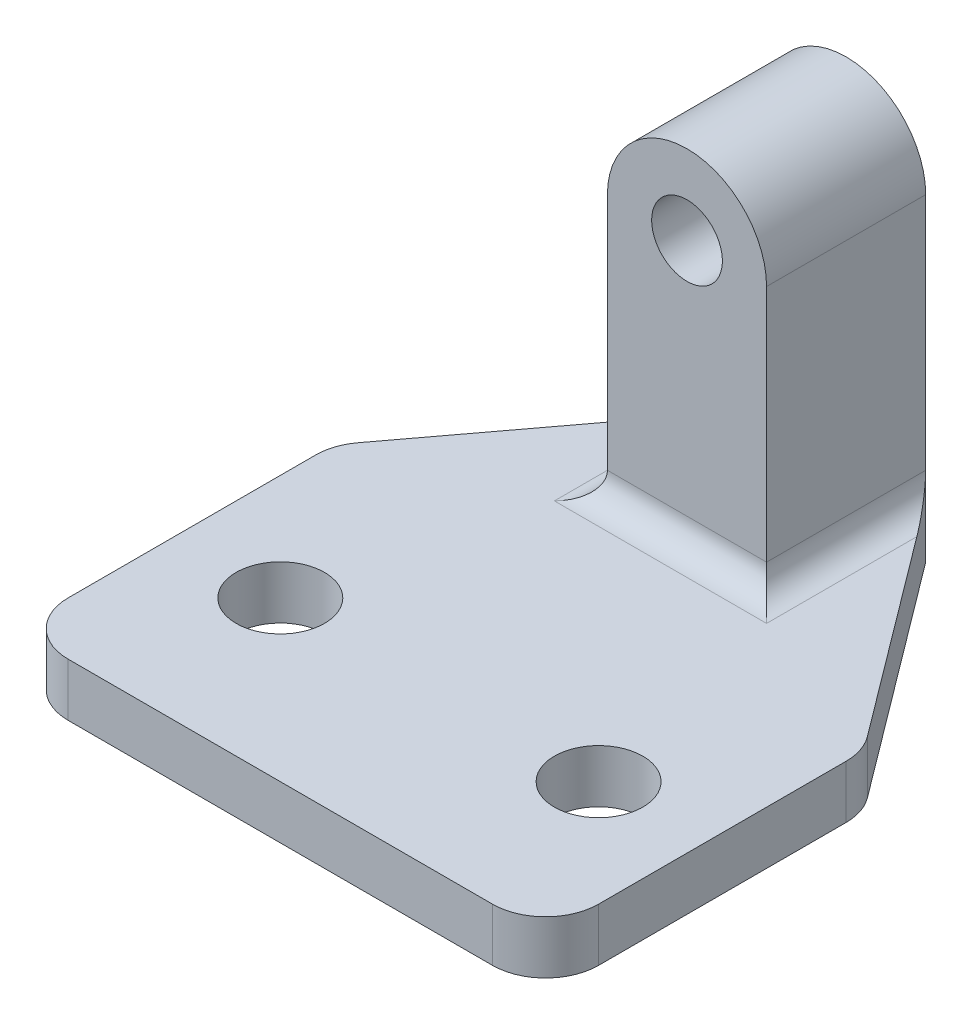
ISO-10303-21;
HEADER;
FILE_DESCRIPTION(('STEP AP214'),'2;1');
FILE_NAME('part.step','',(''),(''),'','','');
FILE_SCHEMA(('AUTOMOTIVE_DESIGN { 1 0 10303 214 1 1 1 1 }'));
ENDSEC;
DATA;
#1=APPLICATION_CONTEXT('core data for automotive mechanical design processes');
#2=APPLICATION_PROTOCOL_DEFINITION('international standard','automotive_design',2000,#1);
#3=PRODUCT_CONTEXT('',#1,'mechanical');
#4=PRODUCT('Part','Part','',(#3));
#5=PRODUCT_RELATED_PRODUCT_CATEGORY('part','',(#4));
#6=PRODUCT_DEFINITION_FORMATION('','',#4);
#7=PRODUCT_DEFINITION_CONTEXT('part definition',#1,'design');
#8=PRODUCT_DEFINITION('design','',#6,#7);
#9=PRODUCT_DEFINITION_SHAPE('','',#8);
#10=(LENGTH_UNIT() NAMED_UNIT(*) SI_UNIT(.MILLI.,.METRE.));
#11=(NAMED_UNIT(*) PLANE_ANGLE_UNIT() SI_UNIT($,.RADIAN.));
#12=(NAMED_UNIT(*) SI_UNIT($,.STERADIAN.) SOLID_ANGLE_UNIT());
#13=UNCERTAINTY_MEASURE_WITH_UNIT(LENGTH_MEASURE(1.E-05),#10,'distance_accuracy_value','');
#14=(GEOMETRIC_REPRESENTATION_CONTEXT(3) GLOBAL_UNCERTAINTY_ASSIGNED_CONTEXT((#13)) GLOBAL_UNIT_ASSIGNED_CONTEXT((#10,
#11,#12)) REPRESENTATION_CONTEXT('',''));
#15=CARTESIAN_POINT('',(0.,0.,0.));
#16=DIRECTION('',(0.,0.,1.));
#17=DIRECTION('',(1.,0.,0.));
#18=AXIS2_PLACEMENT_3D('',#15,#16,#17);
#19=CARTESIAN_POINT('',(0.,3.,0.));
#20=DIRECTION('',(0.,-1.,0.));
#21=DIRECTION('',(0.,0.,-1.));
#22=AXIS2_PLACEMENT_3D('',#19,#20,#21);
#23=PLANE('',#22);
#24=CARTESIAN_POINT('',(-9.,3.,0.));
#25=DIRECTION('',(0.,1.,0.));
#26=DIRECTION('',(0.,0.,1.));
#27=AXIS2_PLACEMENT_3D('',#24,#25,#26);
#28=CIRCLE('',#27,2.5);
#29=CARTESIAN_POINT('',(-9.,3.,2.5));
#30=VERTEX_POINT('',#29);
#31=EDGE_CURVE('E627',#30,#30,#28,.T.);
#32=ORIENTED_EDGE('',*,*,#31,.F.);
#33=EDGE_LOOP('',(#32));
#34=FACE_BOUND('',#33,.T.);
#35=CARTESIAN_POINT('',(9.,3.,0.));
#36=DIRECTION('',(0.,1.,0.));
#37=DIRECTION('',(0.,0.,-1.));
#38=AXIS2_PLACEMENT_3D('',#35,#36,#37);
#39=CIRCLE('',#38,2.5);
#40=CARTESIAN_POINT('',(9.,3.,-2.5));
#41=VERTEX_POINT('',#40);
#42=EDGE_CURVE('E623',#41,#41,#39,.T.);
#43=ORIENTED_EDGE('',*,*,#42,.F.);
#44=EDGE_LOOP('',(#43));
#45=FACE_BOUND('',#44,.T.);
#46=DIRECTION('',(-0.6,0.,0.8));
#47=VECTOR('',#46,1.);
#48=CARTESIAN_POINT('',(-15.,3.,-9.));
#49=LINE('',#48,#47);
#50=CARTESIAN_POINT('',(-6.,3.,-21.));
#51=VERTEX_POINT('',#50);
#52=CARTESIAN_POINT('',(-14.4,3.,-9.79999999999999));
#53=VERTEX_POINT('',#52);
#54=EDGE_CURVE('E212',#51,#53,#49,.T.);
#55=ORIENTED_EDGE('',*,*,#54,.T.);
#56=CARTESIAN_POINT('',(-12.,3.,-7.99999999999999));
#57=DIRECTION('',(0.,-1.,0.));
#58=DIRECTION('',(0.,0.,-1.));
#59=AXIS2_PLACEMENT_3D('',#56,#57,#58);
#60=CIRCLE('',#59,3.);
#61=CARTESIAN_POINT('',(-15.,3.,-7.99999999999999));
#62=VERTEX_POINT('',#61);
#63=EDGE_CURVE('E310',#53,#62,#60,.F.);
#64=ORIENTED_EDGE('',*,*,#63,.T.);
#65=DIRECTION('',(0.,0.,1.));
#66=VECTOR('',#65,1.);
#67=CARTESIAN_POINT('',(-15.,3.,9.));
#68=LINE('',#67,#66);
#69=CARTESIAN_POINT('',(-15.,3.,6.));
#70=VERTEX_POINT('',#69);
#71=EDGE_CURVE('E197',#62,#70,#68,.T.);
#72=ORIENTED_EDGE('',*,*,#71,.T.);
#73=CARTESIAN_POINT('',(-12.,3.,6.));
#74=DIRECTION('',(0.,-1.,0.));
#75=DIRECTION('',(0.,0.,-1.));
#76=AXIS2_PLACEMENT_3D('',#73,#74,#75);
#77=CIRCLE('',#76,3.);
#78=CARTESIAN_POINT('',(-12.,3.,9.));
#79=VERTEX_POINT('',#78);
#80=EDGE_CURVE('E302',#70,#79,#77,.F.);
#81=ORIENTED_EDGE('',*,*,#80,.T.);
#82=DIRECTION('',(1.,0.,0.));
#83=VECTOR('',#82,1.);
#84=CARTESIAN_POINT('',(15.,3.,9.));
#85=LINE('',#84,#83);
#86=CARTESIAN_POINT('',(12.,3.,9.));
#87=VERTEX_POINT('',#86);
#88=EDGE_CURVE('E201',#79,#87,#85,.T.);
#89=ORIENTED_EDGE('',*,*,#88,.T.);
#90=CARTESIAN_POINT('',(12.,3.,6.));
#91=DIRECTION('',(0.,-1.,0.));
#92=DIRECTION('',(0.,0.,-1.));
#93=AXIS2_PLACEMENT_3D('',#90,#91,#92);
#94=CIRCLE('',#93,3.);
#95=CARTESIAN_POINT('',(15.,3.,6.));
#96=VERTEX_POINT('',#95);
#97=EDGE_CURVE('E305',#87,#96,#94,.F.);
#98=ORIENTED_EDGE('',*,*,#97,.T.);
#99=DIRECTION('',(0.,0.,-1.));
#100=VECTOR('',#99,1.);
#101=CARTESIAN_POINT('',(15.,3.,9.));
#102=LINE('',#101,#100);
#103=CARTESIAN_POINT('',(15.,3.,-8.));
#104=VERTEX_POINT('',#103);
#105=EDGE_CURVE('E206',#96,#104,#102,.T.);
#106=ORIENTED_EDGE('',*,*,#105,.T.);
#107=CARTESIAN_POINT('',(12.,3.,-8.));
#108=DIRECTION('',(0.,-1.,0.));
#109=DIRECTION('',(0.,0.,-1.));
#110=AXIS2_PLACEMENT_3D('',#107,#108,#109);
#111=CIRCLE('',#110,3.);
#112=CARTESIAN_POINT('',(14.4,3.,-9.8));
#113=VERTEX_POINT('',#112);
#114=EDGE_CURVE('E59',#104,#113,#111,.F.);
#115=ORIENTED_EDGE('',*,*,#114,.T.);
#116=DIRECTION('',(-0.6,0.,-0.8));
#117=VECTOR('',#116,1.);
#118=CARTESIAN_POINT('',(4.5,3.,-23.));
#119=LINE('',#118,#117);
#120=CARTESIAN_POINT('',(6.,3.,-21.));
#121=VERTEX_POINT('',#120);
#122=EDGE_CURVE('E209',#113,#121,#119,.T.);
#123=ORIENTED_EDGE('',*,*,#122,.T.);
#124=DIRECTION('',(0.,0.,-1.));
#125=VECTOR('',#124,1.);
#126=CARTESIAN_POINT('',(6.,3.,0.));
#127=LINE('',#126,#125);
#128=CARTESIAN_POINT('',(6.,3.,-12.5));
#129=VERTEX_POINT('',#128);
#130=EDGE_CURVE('E246',#121,#129,#127,.F.);
#131=ORIENTED_EDGE('',*,*,#130,.T.);
#132=DIRECTION('',(-1.,0.,0.));
#133=VECTOR('',#132,1.);
#134=CARTESIAN_POINT('',(-4.5,3.,-12.5));
#135=LINE('',#134,#133);
#136=CARTESIAN_POINT('',(-6.,3.,-12.5));
#137=VERTEX_POINT('',#136);
#138=EDGE_CURVE('E243',#129,#137,#135,.T.);
#139=ORIENTED_EDGE('',*,*,#138,.T.);
#140=DIRECTION('',(0.,0.,-1.));
#141=VECTOR('',#140,1.);
#142=CARTESIAN_POINT('',(-6.,3.,0.));
#143=LINE('',#142,#141);
#144=EDGE_CURVE('E249',#137,#51,#143,.T.);
#145=ORIENTED_EDGE('',*,*,#144,.T.);
#146=EDGE_LOOP('',(#55,#64,#72,#81,#89,#98,#106,#115,#123,#131,#139,#145));
#147=FACE_BOUND('',#146,.T.);
#148=ADVANCED_FACE('F43',(#34,#45,#147),#23,.F.);
#149=CARTESIAN_POINT('',(-15.,3.,9.));
#150=DIRECTION('',(1.,0.,0.));
#151=DIRECTION('',(0.,0.,-1.));
#152=AXIS2_PLACEMENT_3D('',#149,#150,#151);
#153=PLANE('',#152);
#154=ORIENTED_EDGE('',*,*,#71,.F.);
#155=DIRECTION('',(0.,-1.,0.));
#156=VECTOR('',#155,1.);
#157=CARTESIAN_POINT('',(-15.,3.,-7.99999999999999));
#158=LINE('',#157,#156);
#159=CARTESIAN_POINT('',(-15.,0.,-7.99999999999999));
#160=VERTEX_POINT('',#159);
#161=EDGE_CURVE('E283',#62,#160,#158,.T.);
#162=ORIENTED_EDGE('',*,*,#161,.T.);
#163=DIRECTION('',(0.,0.,1.));
#164=VECTOR('',#163,1.);
#165=CARTESIAN_POINT('',(-15.,0.,9.));
#166=LINE('',#165,#164);
#167=CARTESIAN_POINT('',(-15.,0.,6.));
#168=VERTEX_POINT('',#167);
#169=EDGE_CURVE('E195',#160,#168,#166,.T.);
#170=ORIENTED_EDGE('',*,*,#169,.T.);
#171=DIRECTION('',(0.,-1.,0.));
#172=VECTOR('',#171,1.);
#173=CARTESIAN_POINT('',(-15.,3.,6.));
#174=LINE('',#173,#172);
#175=EDGE_CURVE('E270',#168,#70,#174,.F.);
#176=ORIENTED_EDGE('',*,*,#175,.T.);
#177=EDGE_LOOP('',(#154,#162,#170,#176));
#178=FACE_BOUND('',#177,.T.);
#179=ADVANCED_FACE('F378',(#178),#153,.F.);
#180=CARTESIAN_POINT('',(15.,3.,9.));
#181=DIRECTION('',(0.,0.,-1.));
#182=DIRECTION('',(-1.,0.,0.));
#183=AXIS2_PLACEMENT_3D('',#180,#181,#182);
#184=PLANE('',#183);
#185=DIRECTION('',(1.,0.,0.));
#186=VECTOR('',#185,1.);
#187=CARTESIAN_POINT('',(15.,0.,9.));
#188=LINE('',#187,#186);
#189=CARTESIAN_POINT('',(-12.,0.,9.));
#190=VERTEX_POINT('',#189);
#191=CARTESIAN_POINT('',(12.,0.,9.));
#192=VERTEX_POINT('',#191);
#193=EDGE_CURVE('E220',#190,#192,#188,.T.);
#194=ORIENTED_EDGE('',*,*,#193,.T.);
#195=DIRECTION('',(0.,-1.,0.));
#196=VECTOR('',#195,1.);
#197=CARTESIAN_POINT('',(12.,3.,9.));
#198=LINE('',#197,#196);
#199=EDGE_CURVE('E11',#192,#87,#198,.F.);
#200=ORIENTED_EDGE('',*,*,#199,.T.);
#201=ORIENTED_EDGE('',*,*,#88,.F.);
#202=DIRECTION('',(0.,-1.,0.));
#203=VECTOR('',#202,1.);
#204=CARTESIAN_POINT('',(-12.,3.,9.));
#205=LINE('',#204,#203);
#206=EDGE_CURVE('E52',#79,#190,#205,.T.);
#207=ORIENTED_EDGE('',*,*,#206,.T.);
#208=EDGE_LOOP('',(#194,#200,#201,#207));
#209=FACE_BOUND('',#208,.T.);
#210=ADVANCED_FACE('F328',(#209),#184,.F.);
#211=CARTESIAN_POINT('',(15.,3.,9.));
#212=DIRECTION('',(-1.,0.,0.));
#213=DIRECTION('',(0.,0.,1.));
#214=AXIS2_PLACEMENT_3D('',#211,#212,#213);
#215=PLANE('',#214);
#216=DIRECTION('',(0.,0.,-1.));
#217=VECTOR('',#216,1.);
#218=CARTESIAN_POINT('',(15.,0.,9.));
#219=LINE('',#218,#217);
#220=CARTESIAN_POINT('',(15.,0.,6.));
#221=VERTEX_POINT('',#220);
#222=CARTESIAN_POINT('',(15.,0.,-8.));
#223=VERTEX_POINT('',#222);
#224=EDGE_CURVE('E224',#221,#223,#219,.T.);
#225=ORIENTED_EDGE('',*,*,#224,.T.);
#226=DIRECTION('',(0.,-1.,0.));
#227=VECTOR('',#226,1.);
#228=CARTESIAN_POINT('',(15.,3.,-8.));
#229=LINE('',#228,#227);
#230=EDGE_CURVE('E67',#223,#104,#229,.F.);
#231=ORIENTED_EDGE('',*,*,#230,.T.);
#232=ORIENTED_EDGE('',*,*,#105,.F.);
#233=DIRECTION('',(0.,-1.,0.));
#234=VECTOR('',#233,1.);
#235=CARTESIAN_POINT('',(15.,3.,6.));
#236=LINE('',#235,#234);
#237=EDGE_CURVE('E317',#96,#221,#236,.T.);
#238=ORIENTED_EDGE('',*,*,#237,.T.);
#239=EDGE_LOOP('',(#225,#231,#232,#238));
#240=FACE_BOUND('',#239,.T.);
#241=ADVANCED_FACE('F340',(#240),#215,.F.);
#242=CARTESIAN_POINT('',(4.5,3.,-23.));
#243=DIRECTION('',(-0.8,0.,0.6));
#244=DIRECTION('',(0.6,0.,0.8));
#245=AXIS2_PLACEMENT_3D('',#242,#243,#244);
#246=PLANE('',#245);
#247=ORIENTED_EDGE('',*,*,#122,.F.);
#248=DIRECTION('',(0.,-1.,0.));
#249=VECTOR('',#248,1.);
#250=CARTESIAN_POINT('',(14.4,3.,-9.8));
#251=LINE('',#250,#249);
#252=CARTESIAN_POINT('',(14.4,0.,-9.8));
#253=VERTEX_POINT('',#252);
#254=EDGE_CURVE('E313',#113,#253,#251,.T.);
#255=ORIENTED_EDGE('',*,*,#254,.T.);
#256=DIRECTION('',(-0.6,0.,-0.8));
#257=VECTOR('',#256,1.);
#258=CARTESIAN_POINT('',(4.5,0.,-23.));
#259=LINE('',#258,#257);
#260=CARTESIAN_POINT('',(4.5,0.,-23.));
#261=VERTEX_POINT('',#260);
#262=EDGE_CURVE('E227',#253,#261,#259,.T.);
#263=ORIENTED_EDGE('',*,*,#262,.T.);
#264=DIRECTION('',(0.,-1.,0.));
#265=VECTOR('',#264,1.);
#266=CARTESIAN_POINT('',(4.5,3.,-23.));
#267=LINE('',#266,#265);
#268=CARTESIAN_POINT('',(4.5,4.5,-23.));
#269=VERTEX_POINT('',#268);
#270=EDGE_CURVE('E239',#269,#261,#267,.T.);
#271=ORIENTED_EDGE('',*,*,#270,.F.);
#272=CARTESIAN_POINT('',(6.,4.5,-21.));
#273=DIRECTION('',(-0.8,0.,0.6));
#274=DIRECTION('',(-0.6,0.,-0.8));
#275=AXIS2_PLACEMENT_3D('',#272,#273,#274);
#276=ELLIPSE('',#275,2.5,1.5);
#277=EDGE_CURVE('E266',#269,#121,#276,.T.);
#278=ORIENTED_EDGE('',*,*,#277,.T.);
#279=EDGE_LOOP('',(#247,#255,#263,#271,#278));
#280=FACE_BOUND('',#279,.T.);
#281=ADVANCED_FACE('F346',(#280),#246,.F.);
#282=CARTESIAN_POINT('',(-4.5,3.,-23.));
#283=DIRECTION('',(0.,0.,1.));
#284=DIRECTION('',(1.,0.,0.));
#285=AXIS2_PLACEMENT_3D('',#282,#283,#284);
#286=PLANE('',#285);
#287=DIRECTION('',(-1.,0.,0.));
#288=VECTOR('',#287,1.);
#289=CARTESIAN_POINT('',(-4.5,0.,-23.));
#290=LINE('',#289,#288);
#291=CARTESIAN_POINT('',(-4.5,0.,-23.));
#292=VERTEX_POINT('',#291);
#293=EDGE_CURVE('E230',#261,#292,#290,.T.);
#294=ORIENTED_EDGE('',*,*,#293,.T.);
#295=DIRECTION('',(0.,-1.,0.));
#296=VECTOR('',#295,1.);
#297=CARTESIAN_POINT('',(-4.5,3.,-23.));
#298=LINE('',#297,#296);
#299=CARTESIAN_POINT('',(-4.5,4.5,-23.));
#300=VERTEX_POINT('',#299);
#301=EDGE_CURVE('E216',#300,#292,#298,.T.);
#302=ORIENTED_EDGE('',*,*,#301,.F.);
#303=DIRECTION('',(0.,1.,0.));
#304=VECTOR('',#303,1.);
#305=CARTESIAN_POINT('',(-4.5,3.,-23.));
#306=LINE('',#305,#304);
#307=CARTESIAN_POINT('',(-4.5,18.,-23.));
#308=VERTEX_POINT('',#307);
#309=EDGE_CURVE('E185',#300,#308,#306,.T.);
#310=ORIENTED_EDGE('',*,*,#309,.T.);
#311=CARTESIAN_POINT('',(0.,18.,-23.));
#312=DIRECTION('',(0.,0.,-1.));
#313=DIRECTION('',(-1.,0.,0.));
#314=AXIS2_PLACEMENT_3D('',#311,#312,#313);
#315=CIRCLE('',#314,4.5);
#316=CARTESIAN_POINT('',(4.5,18.,-23.));
#317=VERTEX_POINT('',#316);
#318=EDGE_CURVE('E172',#308,#317,#315,.T.);
#319=ORIENTED_EDGE('',*,*,#318,.T.);
#320=DIRECTION('',(0.,-1.,0.));
#321=VECTOR('',#320,1.);
#322=CARTESIAN_POINT('',(4.5,3.,-23.));
#323=LINE('',#322,#321);
#324=EDGE_CURVE('E165',#317,#269,#323,.T.);
#325=ORIENTED_EDGE('',*,*,#324,.T.);
#326=ORIENTED_EDGE('',*,*,#270,.T.);
#327=EDGE_LOOP('',(#294,#302,#310,#319,#325,#326));
#328=FACE_BOUND('',#327,.T.);
#329=CARTESIAN_POINT('',(0.,18.,-23.));
#330=DIRECTION('',(0.,0.,-1.));
#331=DIRECTION('',(-1.,0.,0.));
#332=AXIS2_PLACEMENT_3D('',#329,#330,#331);
#333=CIRCLE('',#332,2.);
#334=CARTESIAN_POINT('',(-2.,18.,-23.));
#335=VERTEX_POINT('',#334);
#336=EDGE_CURVE('E280',#335,#335,#333,.T.);
#337=ORIENTED_EDGE('',*,*,#336,.F.);
#338=EDGE_LOOP('',(#337));
#339=FACE_BOUND('',#338,.T.);
#340=ADVANCED_FACE('F350',(#328,#339),#286,.F.);
#341=CARTESIAN_POINT('',(-15.,3.,-9.));
#342=DIRECTION('',(0.8,0.,0.6));
#343=DIRECTION('',(0.6,0.,-0.8));
#344=AXIS2_PLACEMENT_3D('',#341,#342,#343);
#345=PLANE('',#344);
#346=DIRECTION('',(-0.6,0.,0.8));
#347=VECTOR('',#346,1.);
#348=CARTESIAN_POINT('',(-15.,0.,-9.));
#349=LINE('',#348,#347);
#350=CARTESIAN_POINT('',(-14.4,0.,-9.79999999999999));
#351=VERTEX_POINT('',#350);
#352=EDGE_CURVE('E202',#292,#351,#349,.T.);
#353=ORIENTED_EDGE('',*,*,#352,.T.);
#354=DIRECTION('',(0.,-1.,0.));
#355=VECTOR('',#354,1.);
#356=CARTESIAN_POINT('',(-14.4,3.,-9.79999999999999));
#357=LINE('',#356,#355);
#358=EDGE_CURVE('E299',#351,#53,#357,.F.);
#359=ORIENTED_EDGE('',*,*,#358,.T.);
#360=ORIENTED_EDGE('',*,*,#54,.F.);
#361=CARTESIAN_POINT('',(-6.,4.5,-21.));
#362=DIRECTION('',(0.8,0.,0.6));
#363=DIRECTION('',(0.6,0.,-0.8));
#364=AXIS2_PLACEMENT_3D('',#361,#362,#363);
#365=ELLIPSE('',#364,2.5,1.5);
#366=EDGE_CURVE('E262',#51,#300,#365,.T.);
#367=ORIENTED_EDGE('',*,*,#366,.T.);
#368=ORIENTED_EDGE('',*,*,#301,.T.);
#369=EDGE_LOOP('',(#353,#359,#360,#367,#368));
#370=FACE_BOUND('',#369,.T.);
#371=ADVANCED_FACE('F353',(#370),#345,.F.);
#372=CARTESIAN_POINT('',(0.,0.,0.));
#373=DIRECTION('',(0.,-1.,0.));
#374=DIRECTION('',(0.,0.,-1.));
#375=AXIS2_PLACEMENT_3D('',#372,#373,#374);
#376=PLANE('',#375);
#377=CARTESIAN_POINT('',(-9.,0.,0.));
#378=DIRECTION('',(0.,1.,0.));
#379=DIRECTION('',(0.,0.,1.));
#380=AXIS2_PLACEMENT_3D('',#377,#378,#379);
#381=CIRCLE('',#380,2.5);
#382=CARTESIAN_POINT('',(-9.,0.,2.5));
#383=VERTEX_POINT('',#382);
#384=EDGE_CURVE('E276',#383,#383,#381,.T.);
#385=ORIENTED_EDGE('',*,*,#384,.T.);
#386=EDGE_LOOP('',(#385));
#387=FACE_BOUND('',#386,.T.);
#388=CARTESIAN_POINT('',(9.,0.,0.));
#389=DIRECTION('',(0.,1.,0.));
#390=DIRECTION('',(0.,0.,-1.));
#391=AXIS2_PLACEMENT_3D('',#388,#389,#390);
#392=CIRCLE('',#391,2.5);
#393=CARTESIAN_POINT('',(9.,0.,-2.5));
#394=VERTEX_POINT('',#393);
#395=EDGE_CURVE('E619',#394,#394,#392,.T.);
#396=ORIENTED_EDGE('',*,*,#395,.T.);
#397=EDGE_LOOP('',(#396));
#398=FACE_BOUND('',#397,.T.);
#399=ORIENTED_EDGE('',*,*,#169,.F.);
#400=CARTESIAN_POINT('',(-12.,0.,-7.99999999999999));
#401=DIRECTION('',(0.,-1.,0.));
#402=DIRECTION('',(0.,0.,-1.));
#403=AXIS2_PLACEMENT_3D('',#400,#401,#402);
#404=CIRCLE('',#403,3.);
#405=EDGE_CURVE('E296',#160,#351,#404,.T.);
#406=ORIENTED_EDGE('',*,*,#405,.T.);
#407=ORIENTED_EDGE('',*,*,#352,.F.);
#408=ORIENTED_EDGE('',*,*,#293,.F.);
#409=ORIENTED_EDGE('',*,*,#262,.F.);
#410=CARTESIAN_POINT('',(12.,0.,-8.));
#411=DIRECTION('',(0.,-1.,0.));
#412=DIRECTION('',(0.,0.,-1.));
#413=AXIS2_PLACEMENT_3D('',#410,#411,#412);
#414=CIRCLE('',#413,3.);
#415=EDGE_CURVE('E293',#253,#223,#414,.T.);
#416=ORIENTED_EDGE('',*,*,#415,.T.);
#417=ORIENTED_EDGE('',*,*,#224,.F.);
#418=CARTESIAN_POINT('',(12.,0.,6.));
#419=DIRECTION('',(0.,-1.,0.));
#420=DIRECTION('',(0.,0.,-1.));
#421=AXIS2_PLACEMENT_3D('',#418,#419,#420);
#422=CIRCLE('',#421,3.);
#423=EDGE_CURVE('E290',#221,#192,#422,.T.);
#424=ORIENTED_EDGE('',*,*,#423,.T.);
#425=ORIENTED_EDGE('',*,*,#193,.F.);
#426=CARTESIAN_POINT('',(-12.,0.,6.));
#427=DIRECTION('',(0.,-1.,0.));
#428=DIRECTION('',(0.,0.,-1.));
#429=AXIS2_PLACEMENT_3D('',#426,#427,#428);
#430=CIRCLE('',#429,3.);
#431=EDGE_CURVE('E287',#190,#168,#430,.T.);
#432=ORIENTED_EDGE('',*,*,#431,.T.);
#433=EDGE_LOOP('',(#399,#406,#407,#408,#409,#416,#417,#424,#425,#432));
#434=FACE_BOUND('',#433,.T.);
#435=ADVANCED_FACE('F334',(#387,#398,#434),#376,.T.);
#436=CARTESIAN_POINT('',(4.5,3.,-14.));
#437=DIRECTION('',(1.,0.,0.));
#438=DIRECTION('',(0.,0.,-1.));
#439=AXIS2_PLACEMENT_3D('',#436,#437,#438);
#440=PLANE('',#439);
#441=DIRECTION('',(0.,-1.,0.));
#442=VECTOR('',#441,1.);
#443=CARTESIAN_POINT('',(4.5,3.,-14.));
#444=LINE('',#443,#442);
#445=CARTESIAN_POINT('',(4.5,18.,-14.));
#446=VERTEX_POINT('',#445);
#447=CARTESIAN_POINT('',(4.5,4.5,-14.));
#448=VERTEX_POINT('',#447);
#449=EDGE_CURVE('E175',#446,#448,#444,.T.);
#450=ORIENTED_EDGE('',*,*,#449,.T.);
#451=DIRECTION('',(0.,0.,-1.));
#452=VECTOR('',#451,1.);
#453=CARTESIAN_POINT('',(4.5,4.5,-14.));
#454=LINE('',#453,#452);
#455=EDGE_CURVE('E255',#448,#269,#454,.T.);
#456=ORIENTED_EDGE('',*,*,#455,.T.);
#457=ORIENTED_EDGE('',*,*,#324,.F.);
#458=DIRECTION('',(0.,0.,-1.));
#459=VECTOR('',#458,1.);
#460=CARTESIAN_POINT('',(4.5,18.,-14.));
#461=LINE('',#460,#459);
#462=EDGE_CURVE('E174',#446,#317,#461,.T.);
#463=ORIENTED_EDGE('',*,*,#462,.F.);
#464=EDGE_LOOP('',(#450,#456,#457,#463));
#465=FACE_BOUND('',#464,.T.);
#466=ADVANCED_FACE('F366',(#465),#440,.T.);
#467=CARTESIAN_POINT('',(0.,18.,-14.));
#468=DIRECTION('',(0.,0.,-1.));
#469=DIRECTION('',(-1.,0.,0.));
#470=AXIS2_PLACEMENT_3D('',#467,#468,#469);
#471=CYLINDRICAL_SURFACE('',#470,4.5);
#472=ORIENTED_EDGE('',*,*,#318,.F.);
#473=DIRECTION('',(0.,0.,-1.));
#474=VECTOR('',#473,1.);
#475=CARTESIAN_POINT('',(-4.5,18.,-14.));
#476=LINE('',#475,#474);
#477=CARTESIAN_POINT('',(-4.5,18.,-14.));
#478=VERTEX_POINT('',#477);
#479=EDGE_CURVE('E156',#478,#308,#476,.T.);
#480=ORIENTED_EDGE('',*,*,#479,.F.);
#481=CARTESIAN_POINT('',(0.,18.,-14.));
#482=DIRECTION('',(0.,0.,-1.));
#483=DIRECTION('',(-1.,0.,0.));
#484=AXIS2_PLACEMENT_3D('',#481,#482,#483);
#485=CIRCLE('',#484,4.5);
#486=EDGE_CURVE('E164',#478,#446,#485,.T.);
#487=ORIENTED_EDGE('',*,*,#486,.T.);
#488=ORIENTED_EDGE('',*,*,#462,.T.);
#489=EDGE_LOOP('',(#472,#480,#487,#488));
#490=FACE_BOUND('',#489,.T.);
#491=ADVANCED_FACE('F169',(#490),#471,.T.);
#492=CARTESIAN_POINT('',(-4.5,3.,-14.));
#493=DIRECTION('',(-1.,0.,0.));
#494=DIRECTION('',(0.,0.,1.));
#495=AXIS2_PLACEMENT_3D('',#492,#493,#494);
#496=PLANE('',#495);
#497=ORIENTED_EDGE('',*,*,#309,.F.);
#498=DIRECTION('',(0.,0.,-1.));
#499=VECTOR('',#498,1.);
#500=CARTESIAN_POINT('',(-4.5,4.5,-14.));
#501=LINE('',#500,#499);
#502=CARTESIAN_POINT('',(-4.5,4.5,-14.));
#503=VERTEX_POINT('',#502);
#504=EDGE_CURVE('E159',#300,#503,#501,.F.);
#505=ORIENTED_EDGE('',*,*,#504,.T.);
#506=DIRECTION('',(0.,1.,0.));
#507=VECTOR('',#506,1.);
#508=CARTESIAN_POINT('',(-4.5,3.,-14.));
#509=LINE('',#508,#507);
#510=EDGE_CURVE('E152',#503,#478,#509,.T.);
#511=ORIENTED_EDGE('',*,*,#510,.T.);
#512=ORIENTED_EDGE('',*,*,#479,.T.);
#513=EDGE_LOOP('',(#497,#505,#511,#512));
#514=FACE_BOUND('',#513,.T.);
#515=ADVANCED_FACE('F155',(#514),#496,.T.);
#516=CARTESIAN_POINT('',(0.,18.,-14.));
#517=DIRECTION('',(0.,0.,-1.));
#518=DIRECTION('',(-1.,0.,0.));
#519=AXIS2_PLACEMENT_3D('',#516,#517,#518);
#520=PLANE('',#519);
#521=CARTESIAN_POINT('',(0.,18.,-14.));
#522=DIRECTION('',(0.,0.,-1.));
#523=DIRECTION('',(-1.,0.,0.));
#524=AXIS2_PLACEMENT_3D('',#521,#522,#523);
#525=CIRCLE('',#524,2.);
#526=CARTESIAN_POINT('',(-2.,18.,-14.));
#527=VERTEX_POINT('',#526);
#528=EDGE_CURVE('E188',#527,#527,#525,.T.);
#529=ORIENTED_EDGE('',*,*,#528,.T.);
#530=EDGE_LOOP('',(#529));
#531=FACE_BOUND('',#530,.T.);
#532=ORIENTED_EDGE('',*,*,#510,.F.);
#533=DIRECTION('',(-1.,0.,0.));
#534=VECTOR('',#533,1.);
#535=CARTESIAN_POINT('',(4.5,4.5,-14.));
#536=LINE('',#535,#534);
#537=EDGE_CURVE('E259',#503,#448,#536,.F.);
#538=ORIENTED_EDGE('',*,*,#537,.T.);
#539=ORIENTED_EDGE('',*,*,#449,.F.);
#540=ORIENTED_EDGE('',*,*,#486,.F.);
#541=EDGE_LOOP('',(#532,#538,#539,#540));
#542=FACE_BOUND('',#541,.T.);
#543=ADVANCED_FACE('F177',(#531,#542),#520,.F.);
#544=CARTESIAN_POINT('',(0.,18.,-14.));
#545=DIRECTION('',(0.,0.,-1.));
#546=DIRECTION('',(-1.,0.,0.));
#547=AXIS2_PLACEMENT_3D('',#544,#545,#546);
#548=CYLINDRICAL_SURFACE('',#547,2.);
#549=ORIENTED_EDGE('',*,*,#528,.F.);
#550=EDGE_LOOP('',(#549));
#551=FACE_BOUND('',#550,.T.);
#552=ORIENTED_EDGE('',*,*,#336,.T.);
#553=EDGE_LOOP('',(#552));
#554=FACE_BOUND('',#553,.T.);
#555=ADVANCED_FACE('F420',(#551,#554),#548,.F.);
#556=CARTESIAN_POINT('',(6.,4.5,-14.));
#557=DIRECTION('',(0.,0.,-1.));
#558=DIRECTION('',(-1.,0.,0.));
#559=AXIS2_PLACEMENT_3D('',#556,#557,#558);
#560=CYLINDRICAL_SURFACE('',#559,1.5);
#561=ORIENTED_EDGE('',*,*,#277,.F.);
#562=ORIENTED_EDGE('',*,*,#455,.F.);
#563=CARTESIAN_POINT('',(6.,4.5,-12.5));
#564=DIRECTION('',(0.707106781186547,0.,-0.707106781186547));
#565=DIRECTION('',(0.707106781186547,0.,0.707106781186547));
#566=AXIS2_PLACEMENT_3D('',#563,#564,#565);
#567=ELLIPSE('',#566,2.12132034355964,1.5);
#568=EDGE_CURVE('E275',#129,#448,#567,.T.);
#569=ORIENTED_EDGE('',*,*,#568,.F.);
#570=ORIENTED_EDGE('',*,*,#130,.F.);
#571=EDGE_LOOP('',(#561,#562,#569,#570));
#572=FACE_BOUND('',#571,.T.);
#573=ADVANCED_FACE('F370',(#572),#560,.F.);
#574=CARTESIAN_POINT('',(0.,4.5,-12.5));
#575=DIRECTION('',(1.,0.,0.));
#576=DIRECTION('',(0.,0.,-1.));
#577=AXIS2_PLACEMENT_3D('',#574,#575,#576);
#578=CYLINDRICAL_SURFACE('',#577,1.5);
#579=ORIENTED_EDGE('',*,*,#568,.T.);
#580=ORIENTED_EDGE('',*,*,#537,.F.);
#581=CARTESIAN_POINT('',(-6.,4.5,-12.5));
#582=DIRECTION('',(0.707106781186547,0.,0.707106781186547));
#583=DIRECTION('',(0.707106781186547,0.,-0.707106781186547));
#584=AXIS2_PLACEMENT_3D('',#581,#582,#583);
#585=ELLIPSE('',#584,2.12132034355964,1.5);
#586=EDGE_CURVE('E271',#137,#503,#585,.T.);
#587=ORIENTED_EDGE('',*,*,#586,.F.);
#588=ORIENTED_EDGE('',*,*,#138,.F.);
#589=EDGE_LOOP('',(#579,#580,#587,#588));
#590=FACE_BOUND('',#589,.T.);
#591=ADVANCED_FACE('F362',(#590),#578,.F.);
#592=CARTESIAN_POINT('',(-6.,4.5,0.));
#593=DIRECTION('',(0.,0.,-1.));
#594=DIRECTION('',(-1.,0.,0.));
#595=AXIS2_PLACEMENT_3D('',#592,#593,#594);
#596=CYLINDRICAL_SURFACE('',#595,1.5);
#597=ORIENTED_EDGE('',*,*,#586,.T.);
#598=ORIENTED_EDGE('',*,*,#504,.F.);
#599=ORIENTED_EDGE('',*,*,#366,.F.);
#600=ORIENTED_EDGE('',*,*,#144,.F.);
#601=EDGE_LOOP('',(#597,#598,#599,#600));
#602=FACE_BOUND('',#601,.T.);
#603=ADVANCED_FACE('F358',(#602),#596,.F.);
#604=CARTESIAN_POINT('',(-12.,3.,-7.99999999999999));
#605=DIRECTION('',(0.,-1.,0.));
#606=DIRECTION('',(0.,0.,-1.));
#607=AXIS2_PLACEMENT_3D('',#604,#605,#606);
#608=CYLINDRICAL_SURFACE('',#607,3.);
#609=ORIENTED_EDGE('',*,*,#63,.F.);
#610=ORIENTED_EDGE('',*,*,#358,.F.);
#611=ORIENTED_EDGE('',*,*,#405,.F.);
#612=ORIENTED_EDGE('',*,*,#161,.F.);
#613=EDGE_LOOP('',(#609,#610,#611,#612));
#614=FACE_BOUND('',#613,.T.);
#615=ADVANCED_FACE('F376',(#614),#608,.T.);
#616=CARTESIAN_POINT('',(12.,3.,-8.));
#617=DIRECTION('',(0.,-1.,0.));
#618=DIRECTION('',(0.,0.,-1.));
#619=AXIS2_PLACEMENT_3D('',#616,#617,#618);
#620=CYLINDRICAL_SURFACE('',#619,3.);
#621=ORIENTED_EDGE('',*,*,#114,.F.);
#622=ORIENTED_EDGE('',*,*,#230,.F.);
#623=ORIENTED_EDGE('',*,*,#415,.F.);
#624=ORIENTED_EDGE('',*,*,#254,.F.);
#625=EDGE_LOOP('',(#621,#622,#623,#624));
#626=FACE_BOUND('',#625,.T.);
#627=ADVANCED_FACE('F343',(#626),#620,.T.);
#628=CARTESIAN_POINT('',(12.,3.,6.));
#629=DIRECTION('',(0.,-1.,0.));
#630=DIRECTION('',(0.,0.,-1.));
#631=AXIS2_PLACEMENT_3D('',#628,#629,#630);
#632=CYLINDRICAL_SURFACE('',#631,3.);
#633=ORIENTED_EDGE('',*,*,#97,.F.);
#634=ORIENTED_EDGE('',*,*,#199,.F.);
#635=ORIENTED_EDGE('',*,*,#423,.F.);
#636=ORIENTED_EDGE('',*,*,#237,.F.);
#637=EDGE_LOOP('',(#633,#634,#635,#636));
#638=FACE_BOUND('',#637,.T.);
#639=ADVANCED_FACE('F339',(#638),#632,.T.);
#640=CARTESIAN_POINT('',(-12.,3.,6.));
#641=DIRECTION('',(0.,-1.,0.));
#642=DIRECTION('',(0.,0.,-1.));
#643=AXIS2_PLACEMENT_3D('',#640,#641,#642);
#644=CYLINDRICAL_SURFACE('',#643,3.);
#645=ORIENTED_EDGE('',*,*,#80,.F.);
#646=ORIENTED_EDGE('',*,*,#175,.F.);
#647=ORIENTED_EDGE('',*,*,#431,.F.);
#648=ORIENTED_EDGE('',*,*,#206,.F.);
#649=EDGE_LOOP('',(#645,#646,#647,#648));
#650=FACE_BOUND('',#649,.T.);
#651=ADVANCED_FACE('F45',(#650),#644,.T.);
#652=CARTESIAN_POINT('',(9.,0.,0.));
#653=DIRECTION('',(0.,1.,0.));
#654=DIRECTION('',(0.,0.,1.));
#655=AXIS2_PLACEMENT_3D('',#652,#653,#654);
#656=CYLINDRICAL_SURFACE('',#655,2.5);
#657=ORIENTED_EDGE('',*,*,#395,.F.);
#658=EDGE_LOOP('',(#657));
#659=FACE_BOUND('',#658,.T.);
#660=ORIENTED_EDGE('',*,*,#42,.T.);
#661=EDGE_LOOP('',(#660));
#662=FACE_BOUND('',#661,.T.);
#663=ADVANCED_FACE('F381',(#659,#662),#656,.F.);
#664=CARTESIAN_POINT('',(-9.,0.,0.));
#665=DIRECTION('',(0.,1.,0.));
#666=DIRECTION('',(0.,0.,1.));
#667=AXIS2_PLACEMENT_3D('',#664,#665,#666);
#668=CYLINDRICAL_SURFACE('',#667,2.5);
#669=ORIENTED_EDGE('',*,*,#384,.F.);
#670=EDGE_LOOP('',(#669));
#671=FACE_BOUND('',#670,.T.);
#672=ORIENTED_EDGE('',*,*,#31,.T.);
#673=EDGE_LOOP('',(#672));
#674=FACE_BOUND('',#673,.T.);
#675=ADVANCED_FACE('F386',(#671,#674),#668,.F.);
#676=CLOSED_SHELL('',(#148,#179,#210,#241,#281,#340,#371,#435,#466,#491,#515,#543,#555,#573,
#591,#603,#615,#627,#639,#651,#663,#675));
#677=MANIFOLD_SOLID_BREP('B2',#676);
#678=ADVANCED_BREP_SHAPE_REPRESENTATION('',(#18,#677),#14);
#679=SHAPE_DEFINITION_REPRESENTATION(#9,#678);
ENDSEC;
END-ISO-10303-21;
